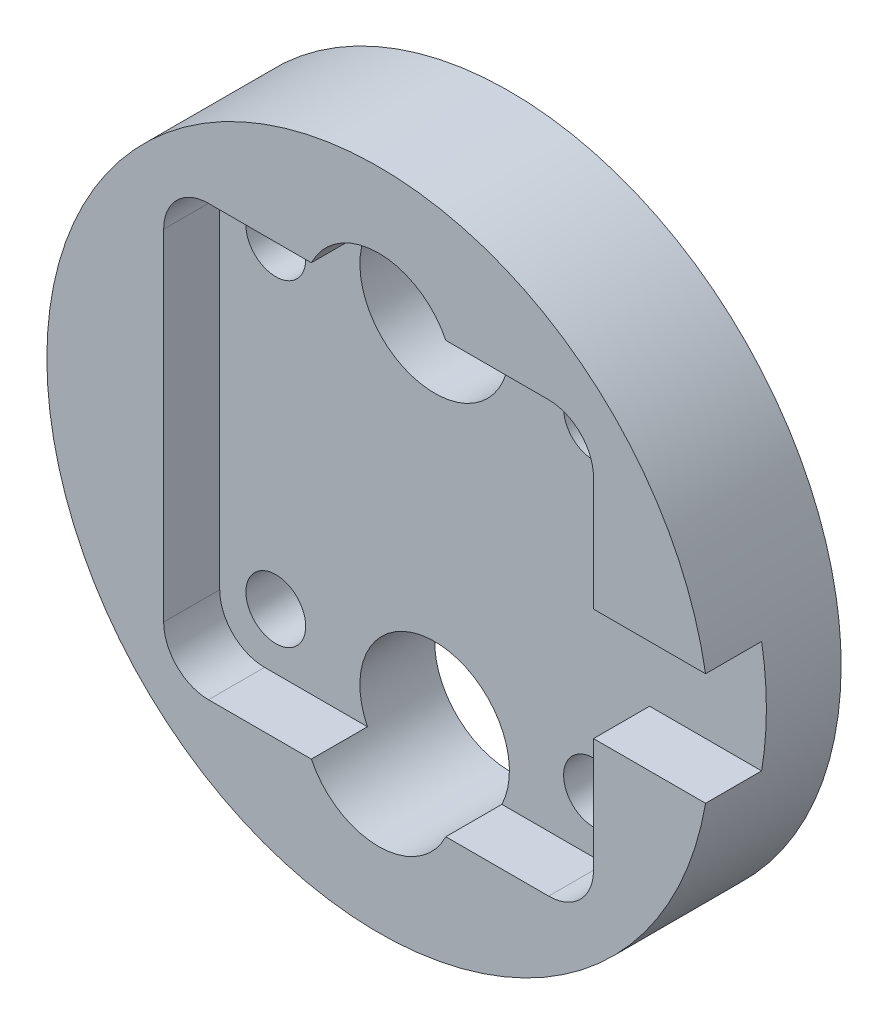
ISO-10303-21;
HEADER;
FILE_DESCRIPTION(('STEP AP214'),'2;1');
FILE_NAME('part.step','',(''),(''),'','','');
FILE_SCHEMA(('AUTOMOTIVE_DESIGN { 1 0 10303 214 1 1 1 1 }'));
ENDSEC;
DATA;
#1=APPLICATION_CONTEXT('core data for automotive mechanical design processes');
#2=APPLICATION_PROTOCOL_DEFINITION('international standard','automotive_design',2000,#1);
#3=PRODUCT_CONTEXT('',#1,'mechanical');
#4=PRODUCT('Part','Part','',(#3));
#5=PRODUCT_RELATED_PRODUCT_CATEGORY('part','',(#4));
#6=PRODUCT_DEFINITION_FORMATION('','',#4);
#7=PRODUCT_DEFINITION_CONTEXT('part definition',#1,'design');
#8=PRODUCT_DEFINITION('design','',#6,#7);
#9=PRODUCT_DEFINITION_SHAPE('','',#8);
#10=(LENGTH_UNIT() NAMED_UNIT(*) SI_UNIT(.MILLI.,.METRE.));
#11=(NAMED_UNIT(*) PLANE_ANGLE_UNIT() SI_UNIT($,.RADIAN.));
#12=(NAMED_UNIT(*) SI_UNIT($,.STERADIAN.) SOLID_ANGLE_UNIT());
#13=UNCERTAINTY_MEASURE_WITH_UNIT(LENGTH_MEASURE(1.E-05),#10,'distance_accuracy_value','');
#14=(GEOMETRIC_REPRESENTATION_CONTEXT(3) GLOBAL_UNCERTAINTY_ASSIGNED_CONTEXT((#13)) GLOBAL_UNIT_ASSIGNED_CONTEXT((#10,
#11,#12)) REPRESENTATION_CONTEXT('',''));
#15=CARTESIAN_POINT('',(0.,0.,0.));
#16=DIRECTION('',(0.,0.,1.));
#17=DIRECTION('',(1.,0.,0.));
#18=AXIS2_PLACEMENT_3D('',#15,#16,#17);
#19=CARTESIAN_POINT('',(11.5,0.,4.));
#20=DIRECTION('',(-1.,0.,0.));
#21=DIRECTION('',(0.,0.,1.));
#22=AXIS2_PLACEMENT_3D('',#19,#20,#21);
#23=PLANE('',#22);
#24=DIRECTION('',(0.,-1.,0.));
#25=VECTOR('',#24,1.);
#26=CARTESIAN_POINT('',(11.5,0.,7.));
#27=LINE('',#26,#25);
#28=CARTESIAN_POINT('',(11.5,9.1,7.));
#29=VERTEX_POINT('',#28);
#30=CARTESIAN_POINT('',(11.5,3.,7.));
#31=VERTEX_POINT('',#30);
#32=EDGE_CURVE('E177',#29,#31,#27,.T.);
#33=ORIENTED_EDGE('',*,*,#32,.F.);
#34=DIRECTION('',(0.,0.,1.));
#35=VECTOR('',#34,1.);
#36=CARTESIAN_POINT('',(11.5,9.1,4.));
#37=LINE('',#36,#35);
#38=CARTESIAN_POINT('',(11.5,9.1,4.));
#39=VERTEX_POINT('',#38);
#40=EDGE_CURVE('E256',#29,#39,#37,.F.);
#41=ORIENTED_EDGE('',*,*,#40,.T.);
#42=DIRECTION('',(0.,-1.,0.));
#43=VECTOR('',#42,1.);
#44=CARTESIAN_POINT('',(11.5,0.,4.));
#45=LINE('',#44,#43);
#46=CARTESIAN_POINT('',(11.5,3.,4.));
#47=VERTEX_POINT('',#46);
#48=EDGE_CURVE('E279',#39,#47,#45,.T.);
#49=ORIENTED_EDGE('',*,*,#48,.T.);
#50=DIRECTION('',(0.,0.,1.));
#51=VECTOR('',#50,1.);
#52=CARTESIAN_POINT('',(11.5,3.,-4.66386172558173));
#53=LINE('',#52,#51);
#54=EDGE_CURVE('E321',#47,#31,#53,.T.);
#55=ORIENTED_EDGE('',*,*,#54,.T.);
#56=EDGE_LOOP('',(#33,#41,#49,#55));
#57=FACE_BOUND('',#56,.T.);
#58=ADVANCED_FACE('F43',(#57),#23,.T.);
#59=CARTESIAN_POINT('',(0.,9.75,7.));
#60=DIRECTION('',(0.,0.,-1.));
#61=DIRECTION('',(-1.,0.,0.));
#62=AXIS2_PLACEMENT_3D('',#59,#60,#61);
#63=CYLINDRICAL_SURFACE('',#62,4.);
#64=CARTESIAN_POINT('',(0.,9.75,0.));
#65=DIRECTION('',(0.,0.,1.));
#66=DIRECTION('',(1.,0.,0.));
#67=AXIS2_PLACEMENT_3D('',#64,#65,#66);
#68=CIRCLE('',#67,4.);
#69=CARTESIAN_POINT('',(4.,9.75,0.));
#70=VERTEX_POINT('',#69);
#71=EDGE_CURVE('E217',#70,#70,#68,.T.);
#72=ORIENTED_EDGE('',*,*,#71,.F.);
#73=EDGE_LOOP('',(#72));
#74=FACE_BOUND('',#73,.T.);
#75=CARTESIAN_POINT('',(0.,9.75,7.));
#76=DIRECTION('',(0.,0.,1.));
#77=DIRECTION('',(1.,0.,0.));
#78=AXIS2_PLACEMENT_3D('',#75,#76,#77);
#79=CIRCLE('',#78,4.);
#80=CARTESIAN_POINT('',(3.59687364248454,11.5,7.));
#81=VERTEX_POINT('',#80);
#82=CARTESIAN_POINT('',(-3.59687364248454,11.5,7.));
#83=VERTEX_POINT('',#82);
#84=EDGE_CURVE('E209',#81,#83,#79,.T.);
#85=ORIENTED_EDGE('',*,*,#84,.T.);
#86=DIRECTION('',(0.,0.,1.));
#87=VECTOR('',#86,1.);
#88=CARTESIAN_POINT('',(-3.59687364248454,11.5,4.));
#89=LINE('',#88,#87);
#90=CARTESIAN_POINT('',(-3.59687364248454,11.5,4.));
#91=VERTEX_POINT('',#90);
#92=EDGE_CURVE('E193',#91,#83,#89,.T.);
#93=ORIENTED_EDGE('',*,*,#92,.F.);
#94=CARTESIAN_POINT('',(0.,9.75,4.));
#95=DIRECTION('',(0.,0.,1.));
#96=DIRECTION('',(1.,0.,0.));
#97=AXIS2_PLACEMENT_3D('',#94,#95,#96);
#98=CIRCLE('',#97,4.);
#99=CARTESIAN_POINT('',(3.59687364248454,11.5,4.));
#100=VERTEX_POINT('',#99);
#101=EDGE_CURVE('E288',#91,#100,#98,.T.);
#102=ORIENTED_EDGE('',*,*,#101,.T.);
#103=DIRECTION('',(0.,0.,1.));
#104=VECTOR('',#103,1.);
#105=CARTESIAN_POINT('',(3.59687364248454,11.5,4.));
#106=LINE('',#105,#104);
#107=EDGE_CURVE('E197',#100,#81,#106,.T.);
#108=ORIENTED_EDGE('',*,*,#107,.T.);
#109=EDGE_LOOP('',(#85,#93,#102,#108));
#110=FACE_BOUND('',#109,.T.);
#111=ADVANCED_FACE('F351',(#74,#110),#63,.F.);
#112=CARTESIAN_POINT('',(0.,-9.75,7.));
#113=DIRECTION('',(0.,0.,-1.));
#114=DIRECTION('',(-1.,0.,0.));
#115=AXIS2_PLACEMENT_3D('',#112,#113,#114);
#116=CYLINDRICAL_SURFACE('',#115,4.);
#117=DIRECTION('',(0.,0.,1.));
#118=VECTOR('',#117,1.);
#119=CARTESIAN_POINT('',(-3.59687364248454,-11.5,4.));
#120=LINE('',#119,#118);
#121=CARTESIAN_POINT('',(-3.59687364248454,-11.5,4.));
#122=VERTEX_POINT('',#121);
#123=CARTESIAN_POINT('',(-3.59687364248454,-11.5,7.));
#124=VERTEX_POINT('',#123);
#125=EDGE_CURVE('E202',#122,#124,#120,.T.);
#126=ORIENTED_EDGE('',*,*,#125,.T.);
#127=CARTESIAN_POINT('',(0.,-9.75,7.));
#128=DIRECTION('',(0.,0.,1.));
#129=DIRECTION('',(1.,0.,0.));
#130=AXIS2_PLACEMENT_3D('',#127,#128,#129);
#131=CIRCLE('',#130,4.);
#132=CARTESIAN_POINT('',(3.59687364248454,-11.5,7.));
#133=VERTEX_POINT('',#132);
#134=EDGE_CURVE('E206',#124,#133,#131,.T.);
#135=ORIENTED_EDGE('',*,*,#134,.T.);
#136=DIRECTION('',(0.,0.,1.));
#137=VECTOR('',#136,1.);
#138=CARTESIAN_POINT('',(3.59687364248454,-11.5,4.));
#139=LINE('',#138,#137);
#140=CARTESIAN_POINT('',(3.59687364248454,-11.5,4.));
#141=VERTEX_POINT('',#140);
#142=EDGE_CURVE('E200',#141,#133,#139,.T.);
#143=ORIENTED_EDGE('',*,*,#142,.F.);
#144=CARTESIAN_POINT('',(0.,-9.75,4.));
#145=DIRECTION('',(0.,0.,1.));
#146=DIRECTION('',(1.,0.,0.));
#147=AXIS2_PLACEMENT_3D('',#144,#145,#146);
#148=CIRCLE('',#147,4.);
#149=EDGE_CURVE('E282',#141,#122,#148,.T.);
#150=ORIENTED_EDGE('',*,*,#149,.T.);
#151=EDGE_LOOP('',(#126,#135,#143,#150));
#152=FACE_BOUND('',#151,.T.);
#153=CARTESIAN_POINT('',(0.,-9.75,0.));
#154=DIRECTION('',(0.,0.,1.));
#155=DIRECTION('',(1.,0.,0.));
#156=AXIS2_PLACEMENT_3D('',#153,#154,#155);
#157=CIRCLE('',#156,4.);
#158=CARTESIAN_POINT('',(4.,-9.75,0.));
#159=VERTEX_POINT('',#158);
#160=EDGE_CURVE('E196',#159,#159,#157,.T.);
#161=ORIENTED_EDGE('',*,*,#160,.F.);
#162=EDGE_LOOP('',(#161));
#163=FACE_BOUND('',#162,.T.);
#164=ADVANCED_FACE('F301',(#152,#163),#116,.F.);
#165=CARTESIAN_POINT('',(0.,0.,7.));
#166=DIRECTION('',(0.,0.,-1.));
#167=DIRECTION('',(-1.,0.,0.));
#168=AXIS2_PLACEMENT_3D('',#165,#166,#167);
#169=CYLINDRICAL_SURFACE('',#168,17.75);
#170=CARTESIAN_POINT('',(0.,0.,7.));
#171=DIRECTION('',(0.,0.,1.));
#172=DIRECTION('',(1.,0.,0.));
#173=AXIS2_PLACEMENT_3D('',#170,#171,#172);
#174=CIRCLE('',#173,17.75);
#175=CARTESIAN_POINT('',(17.4946420369209,3.,7.));
#176=VERTEX_POINT('',#175);
#177=CARTESIAN_POINT('',(17.4946420369209,-2.99999999999999,7.));
#178=VERTEX_POINT('',#177);
#179=EDGE_CURVE('E171',#176,#178,#174,.T.);
#180=ORIENTED_EDGE('',*,*,#179,.F.);
#181=DIRECTION('',(0.,0.,1.));
#182=VECTOR('',#181,1.);
#183=CARTESIAN_POINT('',(17.4946420369209,3.,-4.66386172558173));
#184=LINE('',#183,#182);
#185=CARTESIAN_POINT('',(17.4946420369209,3.,4.));
#186=VERTEX_POINT('',#185);
#187=EDGE_CURVE('E319',#186,#176,#184,.T.);
#188=ORIENTED_EDGE('',*,*,#187,.F.);
#189=CARTESIAN_POINT('',(0.,0.,4.));
#190=DIRECTION('',(0.,0.,1.));
#191=DIRECTION('',(1.,0.,0.));
#192=AXIS2_PLACEMENT_3D('',#189,#190,#191);
#193=CIRCLE('',#192,17.75);
#194=CARTESIAN_POINT('',(17.4946420369209,-2.99999999999999,4.));
#195=VERTEX_POINT('',#194);
#196=EDGE_CURVE('E324',#186,#195,#193,.F.);
#197=ORIENTED_EDGE('',*,*,#196,.T.);
#198=DIRECTION('',(0.,0.,1.));
#199=VECTOR('',#198,1.);
#200=CARTESIAN_POINT('',(17.4946420369209,-2.99999999999999,-4.66386172558173));
#201=LINE('',#200,#199);
#202=EDGE_CURVE('E162',#195,#178,#201,.T.);
#203=ORIENTED_EDGE('',*,*,#202,.T.);
#204=EDGE_LOOP('',(#180,#188,#197,#203));
#205=FACE_BOUND('',#204,.T.);
#206=CARTESIAN_POINT('',(0.,0.,0.));
#207=DIRECTION('',(0.,0.,1.));
#208=DIRECTION('',(1.,0.,0.));
#209=AXIS2_PLACEMENT_3D('',#206,#207,#208);
#210=CIRCLE('',#209,17.75);
#211=CARTESIAN_POINT('',(17.75,0.,0.));
#212=VERTEX_POINT('',#211);
#213=EDGE_CURVE('E210',#212,#212,#210,.T.);
#214=ORIENTED_EDGE('',*,*,#213,.T.);
#215=EDGE_LOOP('',(#214));
#216=FACE_BOUND('',#215,.T.);
#217=ADVANCED_FACE('F332',(#205,#216),#169,.T.);
#218=CARTESIAN_POINT('',(0.,0.,7.));
#219=DIRECTION('',(0.,0.,1.));
#220=DIRECTION('',(1.,0.,0.));
#221=AXIS2_PLACEMENT_3D('',#218,#219,#220);
#222=PLANE('',#221);
#223=DIRECTION('',(-1.,0.,0.));
#224=VECTOR('',#223,1.);
#225=CARTESIAN_POINT('',(11.5,3.,7.));
#226=LINE('',#225,#224);
#227=EDGE_CURVE('E163',#176,#31,#226,.T.);
#228=ORIENTED_EDGE('',*,*,#227,.F.);
#229=ORIENTED_EDGE('',*,*,#179,.T.);
#230=DIRECTION('',(1.,0.,0.));
#231=VECTOR('',#230,1.);
#232=CARTESIAN_POINT('',(11.5,-3.,7.));
#233=LINE('',#232,#231);
#234=CARTESIAN_POINT('',(11.5,-3.,7.));
#235=VERTEX_POINT('',#234);
#236=EDGE_CURVE('E154',#235,#178,#233,.T.);
#237=ORIENTED_EDGE('',*,*,#236,.F.);
#238=CARTESIAN_POINT('',(11.5,-9.1,7.));
#239=VERTEX_POINT('',#238);
#240=EDGE_CURVE('E169',#235,#239,#27,.T.);
#241=ORIENTED_EDGE('',*,*,#240,.T.);
#242=CARTESIAN_POINT('',(9.1,-9.1,7.));
#243=DIRECTION('',(0.,0.,1.));
#244=DIRECTION('',(1.,0.,0.));
#245=AXIS2_PLACEMENT_3D('',#242,#243,#244);
#246=CIRCLE('',#245,2.4);
#247=CARTESIAN_POINT('',(9.1,-11.5,7.));
#248=VERTEX_POINT('',#247);
#249=EDGE_CURVE('E262',#239,#248,#246,.F.);
#250=ORIENTED_EDGE('',*,*,#249,.T.);
#251=DIRECTION('',(1.,0.,0.));
#252=VECTOR('',#251,1.);
#253=CARTESIAN_POINT('',(0.,-11.5,7.));
#254=LINE('',#253,#252);
#255=EDGE_CURVE('E178',#133,#248,#254,.T.);
#256=ORIENTED_EDGE('',*,*,#255,.F.);
#257=ORIENTED_EDGE('',*,*,#134,.F.);
#258=DIRECTION('',(1.,0.,0.));
#259=VECTOR('',#258,1.);
#260=CARTESIAN_POINT('',(0.,-11.5,7.));
#261=LINE('',#260,#259);
#262=CARTESIAN_POINT('',(-9.1,-11.5,7.));
#263=VERTEX_POINT('',#262);
#264=EDGE_CURVE('E182',#263,#124,#261,.T.);
#265=ORIENTED_EDGE('',*,*,#264,.F.);
#266=CARTESIAN_POINT('',(-9.1,-9.1,7.));
#267=DIRECTION('',(0.,0.,1.));
#268=DIRECTION('',(1.,0.,0.));
#269=AXIS2_PLACEMENT_3D('',#266,#267,#268);
#270=CIRCLE('',#269,2.4);
#271=CARTESIAN_POINT('',(-11.5,-9.1,7.));
#272=VERTEX_POINT('',#271);
#273=EDGE_CURVE('E260',#263,#272,#270,.F.);
#274=ORIENTED_EDGE('',*,*,#273,.T.);
#275=DIRECTION('',(0.,-1.,0.));
#276=VECTOR('',#275,1.);
#277=CARTESIAN_POINT('',(-11.5,0.,7.));
#278=LINE('',#277,#276);
#279=CARTESIAN_POINT('',(-11.5,9.1,7.));
#280=VERTEX_POINT('',#279);
#281=EDGE_CURVE('E189',#280,#272,#278,.T.);
#282=ORIENTED_EDGE('',*,*,#281,.F.);
#283=CARTESIAN_POINT('',(-9.1,9.1,7.));
#284=DIRECTION('',(0.,0.,1.));
#285=DIRECTION('',(1.,0.,0.));
#286=AXIS2_PLACEMENT_3D('',#283,#284,#285);
#287=CIRCLE('',#286,2.4);
#288=CARTESIAN_POINT('',(-9.1,11.5,7.));
#289=VERTEX_POINT('',#288);
#290=EDGE_CURVE('E11',#280,#289,#287,.F.);
#291=ORIENTED_EDGE('',*,*,#290,.T.);
#292=DIRECTION('',(1.,0.,0.));
#293=VECTOR('',#292,1.);
#294=CARTESIAN_POINT('',(0.,11.5,7.));
#295=LINE('',#294,#293);
#296=EDGE_CURVE('E187',#289,#83,#295,.T.);
#297=ORIENTED_EDGE('',*,*,#296,.T.);
#298=ORIENTED_EDGE('',*,*,#84,.F.);
#299=DIRECTION('',(1.,0.,0.));
#300=VECTOR('',#299,1.);
#301=CARTESIAN_POINT('',(0.,11.5,7.));
#302=LINE('',#301,#300);
#303=CARTESIAN_POINT('',(9.1,11.5,7.));
#304=VERTEX_POINT('',#303);
#305=EDGE_CURVE('E180',#81,#304,#302,.T.);
#306=ORIENTED_EDGE('',*,*,#305,.T.);
#307=CARTESIAN_POINT('',(9.1,9.1,7.));
#308=DIRECTION('',(0.,0.,1.));
#309=DIRECTION('',(1.,0.,0.));
#310=AXIS2_PLACEMENT_3D('',#307,#308,#309);
#311=CIRCLE('',#310,2.4);
#312=EDGE_CURVE('E51',#304,#29,#311,.F.);
#313=ORIENTED_EDGE('',*,*,#312,.T.);
#314=ORIENTED_EDGE('',*,*,#32,.T.);
#315=EDGE_LOOP('',(#228,#229,#237,#241,#250,#256,#257,#265,#274,#282,#291,#297,#298,#306,#313,#314));
#316=FACE_BOUND('',#315,.T.);
#317=ADVANCED_FACE('F168',(#316),#222,.T.);
#318=CARTESIAN_POINT('',(0.,0.,0.));
#319=DIRECTION('',(0.,0.,1.));
#320=DIRECTION('',(1.,0.,0.));
#321=AXIS2_PLACEMENT_3D('',#318,#319,#320);
#322=PLANE('',#321);
#323=CARTESIAN_POINT('',(-8.5,-8.50000000000001,0.));
#324=DIRECTION('',(0.,0.,1.));
#325=DIRECTION('',(1.,0.,0.));
#326=AXIS2_PLACEMENT_3D('',#323,#324,#325);
#327=CIRCLE('',#326,1.6);
#328=CARTESIAN_POINT('',(-6.9,-8.50000000000001,0.));
#329=VERTEX_POINT('',#328);
#330=EDGE_CURVE('E308',#329,#329,#327,.T.);
#331=ORIENTED_EDGE('',*,*,#330,.T.);
#332=EDGE_LOOP('',(#331));
#333=FACE_BOUND('',#332,.T.);
#334=CARTESIAN_POINT('',(-8.50000000000001,8.5,0.));
#335=DIRECTION('',(0.,0.,1.));
#336=DIRECTION('',(1.,0.,0.));
#337=AXIS2_PLACEMENT_3D('',#334,#335,#336);
#338=CIRCLE('',#337,1.6);
#339=CARTESIAN_POINT('',(-6.90000000000001,8.5,0.));
#340=VERTEX_POINT('',#339);
#341=EDGE_CURVE('E311',#340,#340,#338,.T.);
#342=ORIENTED_EDGE('',*,*,#341,.T.);
#343=EDGE_LOOP('',(#342));
#344=FACE_BOUND('',#343,.T.);
#345=CARTESIAN_POINT('',(8.5,8.50000000000001,0.));
#346=DIRECTION('',(0.,0.,1.));
#347=DIRECTION('',(1.,0.,0.));
#348=AXIS2_PLACEMENT_3D('',#345,#346,#347);
#349=CIRCLE('',#348,1.6);
#350=CARTESIAN_POINT('',(10.1,8.50000000000001,0.));
#351=VERTEX_POINT('',#350);
#352=EDGE_CURVE('E307',#351,#351,#349,.T.);
#353=ORIENTED_EDGE('',*,*,#352,.T.);
#354=EDGE_LOOP('',(#353));
#355=FACE_BOUND('',#354,.T.);
#356=CARTESIAN_POINT('',(8.50000000000001,-8.5,0.));
#357=DIRECTION('',(0.,0.,1.));
#358=DIRECTION('',(1.,0.,0.));
#359=AXIS2_PLACEMENT_3D('',#356,#357,#358);
#360=CIRCLE('',#359,1.6);
#361=CARTESIAN_POINT('',(10.1,-8.5,0.));
#362=VERTEX_POINT('',#361);
#363=EDGE_CURVE('E226',#362,#362,#360,.T.);
#364=ORIENTED_EDGE('',*,*,#363,.T.);
#365=EDGE_LOOP('',(#364));
#366=FACE_BOUND('',#365,.T.);
#367=ORIENTED_EDGE('',*,*,#160,.T.);
#368=EDGE_LOOP('',(#367));
#369=FACE_BOUND('',#368,.T.);
#370=ORIENTED_EDGE('',*,*,#71,.T.);
#371=EDGE_LOOP('',(#370));
#372=FACE_BOUND('',#371,.T.);
#373=ORIENTED_EDGE('',*,*,#213,.F.);
#374=EDGE_LOOP('',(#373));
#375=FACE_BOUND('',#374,.T.);
#376=ADVANCED_FACE('F515',(#333,#344,#355,#366,#369,#372,#375),#322,.F.);
#377=CARTESIAN_POINT('',(0.,-11.5,4.));
#378=DIRECTION('',(0.,-1.,0.));
#379=DIRECTION('',(0.,0.,-1.));
#380=AXIS2_PLACEMENT_3D('',#377,#378,#379);
#381=PLANE('',#380);
#382=DIRECTION('',(1.,0.,0.));
#383=VECTOR('',#382,1.);
#384=CARTESIAN_POINT('',(0.,-11.5,4.));
#385=LINE('',#384,#383);
#386=CARTESIAN_POINT('',(-9.1,-11.5,4.));
#387=VERTEX_POINT('',#386);
#388=EDGE_CURVE('E192',#387,#122,#385,.T.);
#389=ORIENTED_EDGE('',*,*,#388,.F.);
#390=DIRECTION('',(0.,0.,1.));
#391=VECTOR('',#390,1.);
#392=CARTESIAN_POINT('',(-9.1,-11.5,7.));
#393=LINE('',#392,#391);
#394=EDGE_CURVE('E214',#387,#263,#393,.T.);
#395=ORIENTED_EDGE('',*,*,#394,.T.);
#396=ORIENTED_EDGE('',*,*,#264,.T.);
#397=ORIENTED_EDGE('',*,*,#125,.F.);
#398=EDGE_LOOP('',(#389,#395,#396,#397));
#399=FACE_BOUND('',#398,.T.);
#400=ADVANCED_FACE('F297',(#399),#381,.F.);
#401=CARTESIAN_POINT('',(-11.5,0.,4.));
#402=DIRECTION('',(-1.,0.,0.));
#403=DIRECTION('',(0.,0.,1.));
#404=AXIS2_PLACEMENT_3D('',#401,#402,#403);
#405=PLANE('',#404);
#406=ORIENTED_EDGE('',*,*,#281,.T.);
#407=DIRECTION('',(0.,0.,1.));
#408=VECTOR('',#407,1.);
#409=CARTESIAN_POINT('',(-11.5,-9.1,4.));
#410=LINE('',#409,#408);
#411=CARTESIAN_POINT('',(-11.5,-9.1,4.));
#412=VERTEX_POINT('',#411);
#413=EDGE_CURVE('E240',#272,#412,#410,.F.);
#414=ORIENTED_EDGE('',*,*,#413,.T.);
#415=DIRECTION('',(0.,-1.,0.));
#416=VECTOR('',#415,1.);
#417=CARTESIAN_POINT('',(-11.5,0.,4.));
#418=LINE('',#417,#416);
#419=CARTESIAN_POINT('',(-11.5,9.1,4.));
#420=VERTEX_POINT('',#419);
#421=EDGE_CURVE('E205',#420,#412,#418,.T.);
#422=ORIENTED_EDGE('',*,*,#421,.F.);
#423=DIRECTION('',(0.,0.,1.));
#424=VECTOR('',#423,1.);
#425=CARTESIAN_POINT('',(-11.5,9.1,4.));
#426=LINE('',#425,#424);
#427=EDGE_CURVE('E237',#420,#280,#426,.T.);
#428=ORIENTED_EDGE('',*,*,#427,.T.);
#429=EDGE_LOOP('',(#406,#414,#422,#428));
#430=FACE_BOUND('',#429,.T.);
#431=ADVANCED_FACE('F362',(#430),#405,.F.);
#432=CARTESIAN_POINT('',(0.,11.5,4.));
#433=DIRECTION('',(0.,-1.,0.));
#434=DIRECTION('',(0.,0.,-1.));
#435=AXIS2_PLACEMENT_3D('',#432,#433,#434);
#436=PLANE('',#435);
#437=ORIENTED_EDGE('',*,*,#296,.F.);
#438=DIRECTION('',(0.,0.,1.));
#439=VECTOR('',#438,1.);
#440=CARTESIAN_POINT('',(-9.1,11.5,4.));
#441=LINE('',#440,#439);
#442=CARTESIAN_POINT('',(-9.1,11.5,4.));
#443=VERTEX_POINT('',#442);
#444=EDGE_CURVE('E258',#289,#443,#441,.F.);
#445=ORIENTED_EDGE('',*,*,#444,.T.);
#446=DIRECTION('',(1.,0.,0.));
#447=VECTOR('',#446,1.);
#448=CARTESIAN_POINT('',(0.,11.5,4.));
#449=LINE('',#448,#447);
#450=EDGE_CURVE('E291',#443,#91,#449,.T.);
#451=ORIENTED_EDGE('',*,*,#450,.T.);
#452=ORIENTED_EDGE('',*,*,#92,.T.);
#453=EDGE_LOOP('',(#437,#445,#451,#452));
#454=FACE_BOUND('',#453,.T.);
#455=ADVANCED_FACE('F355',(#454),#436,.T.);
#456=CARTESIAN_POINT('',(0.,11.5,4.));
#457=DIRECTION('',(0.,-1.,0.));
#458=DIRECTION('',(0.,0.,-1.));
#459=AXIS2_PLACEMENT_3D('',#456,#457,#458);
#460=PLANE('',#459);
#461=DIRECTION('',(1.,0.,0.));
#462=VECTOR('',#461,1.);
#463=CARTESIAN_POINT('',(0.,11.5,4.));
#464=LINE('',#463,#462);
#465=CARTESIAN_POINT('',(9.1,11.5,4.));
#466=VERTEX_POINT('',#465);
#467=EDGE_CURVE('E281',#100,#466,#464,.T.);
#468=ORIENTED_EDGE('',*,*,#467,.T.);
#469=DIRECTION('',(0.,0.,1.));
#470=VECTOR('',#469,1.);
#471=CARTESIAN_POINT('',(9.1,11.5,7.));
#472=LINE('',#471,#470);
#473=EDGE_CURVE('E253',#466,#304,#472,.T.);
#474=ORIENTED_EDGE('',*,*,#473,.T.);
#475=ORIENTED_EDGE('',*,*,#305,.F.);
#476=ORIENTED_EDGE('',*,*,#107,.F.);
#477=EDGE_LOOP('',(#468,#474,#475,#476));
#478=FACE_BOUND('',#477,.T.);
#479=ADVANCED_FACE('F348',(#478),#460,.T.);
#480=CARTESIAN_POINT('',(11.5,-3.,4.));
#481=VERTEX_POINT('',#480);
#482=CARTESIAN_POINT('',(11.5,-9.1,4.));
#483=VERTEX_POINT('',#482);
#484=EDGE_CURVE('E277',#481,#483,#45,.T.);
#485=ORIENTED_EDGE('',*,*,#484,.T.);
#486=DIRECTION('',(0.,0.,1.));
#487=VECTOR('',#486,1.);
#488=CARTESIAN_POINT('',(11.5,-9.1,4.));
#489=LINE('',#488,#487);
#490=EDGE_CURVE('E176',#483,#239,#489,.T.);
#491=ORIENTED_EDGE('',*,*,#490,.T.);
#492=ORIENTED_EDGE('',*,*,#240,.F.);
#493=DIRECTION('',(0.,0.,1.));
#494=VECTOR('',#493,1.);
#495=CARTESIAN_POINT('',(11.5,-3.,-4.66386172558173));
#496=LINE('',#495,#494);
#497=EDGE_CURVE('E151',#481,#235,#496,.T.);
#498=ORIENTED_EDGE('',*,*,#497,.F.);
#499=EDGE_LOOP('',(#485,#491,#492,#498));
#500=FACE_BOUND('',#499,.T.);
#501=ADVANCED_FACE('F174',(#500),#23,.T.);
#502=CARTESIAN_POINT('',(0.,-11.5,4.));
#503=DIRECTION('',(0.,-1.,0.));
#504=DIRECTION('',(0.,0.,-1.));
#505=AXIS2_PLACEMENT_3D('',#502,#503,#504);
#506=PLANE('',#505);
#507=ORIENTED_EDGE('',*,*,#255,.T.);
#508=DIRECTION('',(0.,0.,1.));
#509=VECTOR('',#508,1.);
#510=CARTESIAN_POINT('',(9.1,-11.5,4.));
#511=LINE('',#510,#509);
#512=CARTESIAN_POINT('',(9.1,-11.5,4.));
#513=VERTEX_POINT('',#512);
#514=EDGE_CURVE('E251',#248,#513,#511,.F.);
#515=ORIENTED_EDGE('',*,*,#514,.T.);
#516=DIRECTION('',(1.,0.,0.));
#517=VECTOR('',#516,1.);
#518=CARTESIAN_POINT('',(0.,-11.5,4.));
#519=LINE('',#518,#517);
#520=EDGE_CURVE('E278',#141,#513,#519,.T.);
#521=ORIENTED_EDGE('',*,*,#520,.F.);
#522=ORIENTED_EDGE('',*,*,#142,.T.);
#523=EDGE_LOOP('',(#507,#515,#521,#522));
#524=FACE_BOUND('',#523,.T.);
#525=ADVANCED_FACE('F268',(#524),#506,.F.);
#526=CARTESIAN_POINT('',(0.,-9.75,4.));
#527=DIRECTION('',(0.,0.,1.));
#528=DIRECTION('',(1.,0.,0.));
#529=AXIS2_PLACEMENT_3D('',#526,#527,#528);
#530=PLANE('',#529);
#531=CARTESIAN_POINT('',(-8.5,-8.50000000000001,4.));
#532=DIRECTION('',(0.,0.,1.));
#533=DIRECTION('',(1.,0.,0.));
#534=AXIS2_PLACEMENT_3D('',#531,#532,#533);
#535=CIRCLE('',#534,1.6);
#536=CARTESIAN_POINT('',(-6.9,-8.50000000000001,4.));
#537=VERTEX_POINT('',#536);
#538=EDGE_CURVE('E232',#537,#537,#535,.F.);
#539=ORIENTED_EDGE('',*,*,#538,.T.);
#540=EDGE_LOOP('',(#539));
#541=FACE_BOUND('',#540,.T.);
#542=CARTESIAN_POINT('',(-8.50000000000001,8.5,4.));
#543=DIRECTION('',(0.,0.,1.));
#544=DIRECTION('',(1.,0.,0.));
#545=AXIS2_PLACEMENT_3D('',#542,#543,#544);
#546=CIRCLE('',#545,1.6);
#547=CARTESIAN_POINT('',(-6.90000000000001,8.5,4.));
#548=VERTEX_POINT('',#547);
#549=EDGE_CURVE('E229',#548,#548,#546,.F.);
#550=ORIENTED_EDGE('',*,*,#549,.T.);
#551=EDGE_LOOP('',(#550));
#552=FACE_BOUND('',#551,.T.);
#553=CARTESIAN_POINT('',(8.5,8.50000000000001,4.));
#554=DIRECTION('',(0.,0.,1.));
#555=DIRECTION('',(1.,0.,0.));
#556=AXIS2_PLACEMENT_3D('',#553,#554,#555);
#557=CIRCLE('',#556,1.6);
#558=CARTESIAN_POINT('',(10.1,8.50000000000001,4.));
#559=VERTEX_POINT('',#558);
#560=EDGE_CURVE('E225',#559,#559,#557,.F.);
#561=ORIENTED_EDGE('',*,*,#560,.T.);
#562=EDGE_LOOP('',(#561));
#563=FACE_BOUND('',#562,.T.);
#564=CARTESIAN_POINT('',(8.50000000000001,-8.5,4.));
#565=DIRECTION('',(0.,0.,1.));
#566=DIRECTION('',(1.,0.,0.));
#567=AXIS2_PLACEMENT_3D('',#564,#565,#566);
#568=CIRCLE('',#567,1.6);
#569=CARTESIAN_POINT('',(10.1,-8.5,4.));
#570=VERTEX_POINT('',#569);
#571=EDGE_CURVE('E222',#570,#570,#568,.F.);
#572=ORIENTED_EDGE('',*,*,#571,.T.);
#573=EDGE_LOOP('',(#572));
#574=FACE_BOUND('',#573,.T.);
#575=ORIENTED_EDGE('',*,*,#421,.T.);
#576=CARTESIAN_POINT('',(-9.1,-9.1,4.));
#577=DIRECTION('',(0.,0.,1.));
#578=DIRECTION('',(1.,0.,0.));
#579=AXIS2_PLACEMENT_3D('',#576,#577,#578);
#580=CIRCLE('',#579,2.4);
#581=EDGE_CURVE('E248',#412,#387,#580,.T.);
#582=ORIENTED_EDGE('',*,*,#581,.T.);
#583=ORIENTED_EDGE('',*,*,#388,.T.);
#584=ORIENTED_EDGE('',*,*,#149,.F.);
#585=ORIENTED_EDGE('',*,*,#520,.T.);
#586=CARTESIAN_POINT('',(9.1,-9.1,4.));
#587=DIRECTION('',(0.,0.,1.));
#588=DIRECTION('',(1.,0.,0.));
#589=AXIS2_PLACEMENT_3D('',#586,#587,#588);
#590=CIRCLE('',#589,2.4);
#591=EDGE_CURVE('E246',#513,#483,#590,.T.);
#592=ORIENTED_EDGE('',*,*,#591,.T.);
#593=ORIENTED_EDGE('',*,*,#484,.F.);
#594=DIRECTION('',(-1.,0.,0.));
#595=VECTOR('',#594,1.);
#596=CARTESIAN_POINT('',(11.5,-3.,4.));
#597=LINE('',#596,#595);
#598=EDGE_CURVE('E157',#195,#481,#597,.T.);
#599=ORIENTED_EDGE('',*,*,#598,.F.);
#600=ORIENTED_EDGE('',*,*,#196,.F.);
#601=DIRECTION('',(1.,0.,0.));
#602=VECTOR('',#601,1.);
#603=CARTESIAN_POINT('',(11.5,3.,4.));
#604=LINE('',#603,#602);
#605=EDGE_CURVE('E316',#47,#186,#604,.T.);
#606=ORIENTED_EDGE('',*,*,#605,.F.);
#607=ORIENTED_EDGE('',*,*,#48,.F.);
#608=CARTESIAN_POINT('',(9.1,9.1,4.));
#609=DIRECTION('',(0.,0.,1.));
#610=DIRECTION('',(1.,0.,0.));
#611=AXIS2_PLACEMENT_3D('',#608,#609,#610);
#612=CIRCLE('',#611,2.4);
#613=EDGE_CURVE('E244',#39,#466,#612,.T.);
#614=ORIENTED_EDGE('',*,*,#613,.T.);
#615=ORIENTED_EDGE('',*,*,#467,.F.);
#616=ORIENTED_EDGE('',*,*,#101,.F.);
#617=ORIENTED_EDGE('',*,*,#450,.F.);
#618=CARTESIAN_POINT('',(-9.1,9.1,4.));
#619=DIRECTION('',(0.,0.,1.));
#620=DIRECTION('',(1.,0.,0.));
#621=AXIS2_PLACEMENT_3D('',#618,#619,#620);
#622=CIRCLE('',#621,2.4);
#623=EDGE_CURVE('E242',#443,#420,#622,.T.);
#624=ORIENTED_EDGE('',*,*,#623,.T.);
#625=EDGE_LOOP('',(#575,#582,#583,#584,#585,#592,#593,#599,#600,#606,#607,#614,#615,#616,#617,#624));
#626=FACE_BOUND('',#625,.T.);
#627=ADVANCED_FACE('F276',(#541,#552,#563,#574,#626),#530,.T.);
#628=CARTESIAN_POINT('',(8.50000000000001,-8.5,7.));
#629=DIRECTION('',(0.,0.,-1.));
#630=DIRECTION('',(-1.,0.,0.));
#631=AXIS2_PLACEMENT_3D('',#628,#629,#630);
#632=CYLINDRICAL_SURFACE('',#631,1.6);
#633=ORIENTED_EDGE('',*,*,#571,.F.);
#634=EDGE_LOOP('',(#633));
#635=FACE_BOUND('',#634,.T.);
#636=ORIENTED_EDGE('',*,*,#363,.F.);
#637=EDGE_LOOP('',(#636));
#638=FACE_BOUND('',#637,.T.);
#639=ADVANCED_FACE('F400',(#635,#638),#632,.F.);
#640=CARTESIAN_POINT('',(8.5,8.50000000000001,7.));
#641=DIRECTION('',(0.,0.,-1.));
#642=DIRECTION('',(-1.,0.,0.));
#643=AXIS2_PLACEMENT_3D('',#640,#641,#642);
#644=CYLINDRICAL_SURFACE('',#643,1.6);
#645=ORIENTED_EDGE('',*,*,#560,.F.);
#646=EDGE_LOOP('',(#645));
#647=FACE_BOUND('',#646,.T.);
#648=ORIENTED_EDGE('',*,*,#352,.F.);
#649=EDGE_LOOP('',(#648));
#650=FACE_BOUND('',#649,.T.);
#651=ADVANCED_FACE('F404',(#647,#650),#644,.F.);
#652=CARTESIAN_POINT('',(-8.50000000000001,8.5,7.));
#653=DIRECTION('',(0.,0.,-1.));
#654=DIRECTION('',(-1.,0.,0.));
#655=AXIS2_PLACEMENT_3D('',#652,#653,#654);
#656=CYLINDRICAL_SURFACE('',#655,1.6);
#657=ORIENTED_EDGE('',*,*,#549,.F.);
#658=EDGE_LOOP('',(#657));
#659=FACE_BOUND('',#658,.T.);
#660=ORIENTED_EDGE('',*,*,#341,.F.);
#661=EDGE_LOOP('',(#660));
#662=FACE_BOUND('',#661,.T.);
#663=ADVANCED_FACE('F409',(#659,#662),#656,.F.);
#664=CARTESIAN_POINT('',(-8.5,-8.50000000000001,7.));
#665=DIRECTION('',(0.,0.,-1.));
#666=DIRECTION('',(-1.,0.,0.));
#667=AXIS2_PLACEMENT_3D('',#664,#665,#666);
#668=CYLINDRICAL_SURFACE('',#667,1.6);
#669=ORIENTED_EDGE('',*,*,#538,.F.);
#670=EDGE_LOOP('',(#669));
#671=FACE_BOUND('',#670,.T.);
#672=ORIENTED_EDGE('',*,*,#330,.F.);
#673=EDGE_LOOP('',(#672));
#674=FACE_BOUND('',#673,.T.);
#675=ADVANCED_FACE('F406',(#671,#674),#668,.F.);
#676=CARTESIAN_POINT('',(11.5,3.,-4.66386172558173));
#677=DIRECTION('',(0.,1.,0.));
#678=DIRECTION('',(0.,0.,1.));
#679=AXIS2_PLACEMENT_3D('',#676,#677,#678);
#680=PLANE('',#679);
#681=ORIENTED_EDGE('',*,*,#605,.T.);
#682=ORIENTED_EDGE('',*,*,#187,.T.);
#683=ORIENTED_EDGE('',*,*,#227,.T.);
#684=ORIENTED_EDGE('',*,*,#54,.F.);
#685=EDGE_LOOP('',(#681,#682,#683,#684));
#686=FACE_BOUND('',#685,.T.);
#687=ADVANCED_FACE('F339',(#686),#680,.F.);
#688=CARTESIAN_POINT('',(11.5,-3.,-4.66386172558173));
#689=DIRECTION('',(0.,-1.,0.));
#690=DIRECTION('',(0.,0.,-1.));
#691=AXIS2_PLACEMENT_3D('',#688,#689,#690);
#692=PLANE('',#691);
#693=ORIENTED_EDGE('',*,*,#598,.T.);
#694=ORIENTED_EDGE('',*,*,#497,.T.);
#695=ORIENTED_EDGE('',*,*,#236,.T.);
#696=ORIENTED_EDGE('',*,*,#202,.F.);
#697=EDGE_LOOP('',(#693,#694,#695,#696));
#698=FACE_BOUND('',#697,.T.);
#699=ADVANCED_FACE('F153',(#698),#692,.F.);
#700=CARTESIAN_POINT('',(-9.1,-9.1,4.));
#701=DIRECTION('',(0.,0.,-1.));
#702=DIRECTION('',(-1.,0.,0.));
#703=AXIS2_PLACEMENT_3D('',#700,#701,#702);
#704=CYLINDRICAL_SURFACE('',#703,2.4);
#705=ORIENTED_EDGE('',*,*,#581,.F.);
#706=ORIENTED_EDGE('',*,*,#413,.F.);
#707=ORIENTED_EDGE('',*,*,#273,.F.);
#708=ORIENTED_EDGE('',*,*,#394,.F.);
#709=EDGE_LOOP('',(#705,#706,#707,#708));
#710=FACE_BOUND('',#709,.T.);
#711=ADVANCED_FACE('F366',(#710),#704,.F.);
#712=CARTESIAN_POINT('',(9.1,-9.1,4.));
#713=DIRECTION('',(0.,0.,1.));
#714=DIRECTION('',(1.,0.,0.));
#715=AXIS2_PLACEMENT_3D('',#712,#713,#714);
#716=CYLINDRICAL_SURFACE('',#715,2.4);
#717=ORIENTED_EDGE('',*,*,#591,.F.);
#718=ORIENTED_EDGE('',*,*,#514,.F.);
#719=ORIENTED_EDGE('',*,*,#249,.F.);
#720=ORIENTED_EDGE('',*,*,#490,.F.);
#721=EDGE_LOOP('',(#717,#718,#719,#720));
#722=FACE_BOUND('',#721,.T.);
#723=ADVANCED_FACE('F273',(#722),#716,.F.);
#724=CARTESIAN_POINT('',(9.1,9.1,4.));
#725=DIRECTION('',(0.,0.,-1.));
#726=DIRECTION('',(-1.,0.,0.));
#727=AXIS2_PLACEMENT_3D('',#724,#725,#726);
#728=CYLINDRICAL_SURFACE('',#727,2.4);
#729=ORIENTED_EDGE('',*,*,#613,.F.);
#730=ORIENTED_EDGE('',*,*,#40,.F.);
#731=ORIENTED_EDGE('',*,*,#312,.F.);
#732=ORIENTED_EDGE('',*,*,#473,.F.);
#733=EDGE_LOOP('',(#729,#730,#731,#732));
#734=FACE_BOUND('',#733,.T.);
#735=ADVANCED_FACE('F343',(#734),#728,.F.);
#736=CARTESIAN_POINT('',(-9.1,9.1,4.));
#737=DIRECTION('',(0.,0.,1.));
#738=DIRECTION('',(1.,0.,0.));
#739=AXIS2_PLACEMENT_3D('',#736,#737,#738);
#740=CYLINDRICAL_SURFACE('',#739,2.4);
#741=ORIENTED_EDGE('',*,*,#623,.F.);
#742=ORIENTED_EDGE('',*,*,#444,.F.);
#743=ORIENTED_EDGE('',*,*,#290,.F.);
#744=ORIENTED_EDGE('',*,*,#427,.F.);
#745=EDGE_LOOP('',(#741,#742,#743,#744));
#746=FACE_BOUND('',#745,.T.);
#747=ADVANCED_FACE('F45',(#746),#740,.F.);
#748=CLOSED_SHELL('',(#58,#111,#164,#217,#317,#376,#400,#431,#455,#479,#501,#525,#627,#639,#651,
#663,#675,#687,#699,#711,#723,#735,#747));
#749=MANIFOLD_SOLID_BREP('B2',#748);
#750=ADVANCED_BREP_SHAPE_REPRESENTATION('',(#18,#749),#14);
#751=SHAPE_DEFINITION_REPRESENTATION(#9,#750);
ENDSEC;
END-ISO-10303-21;
